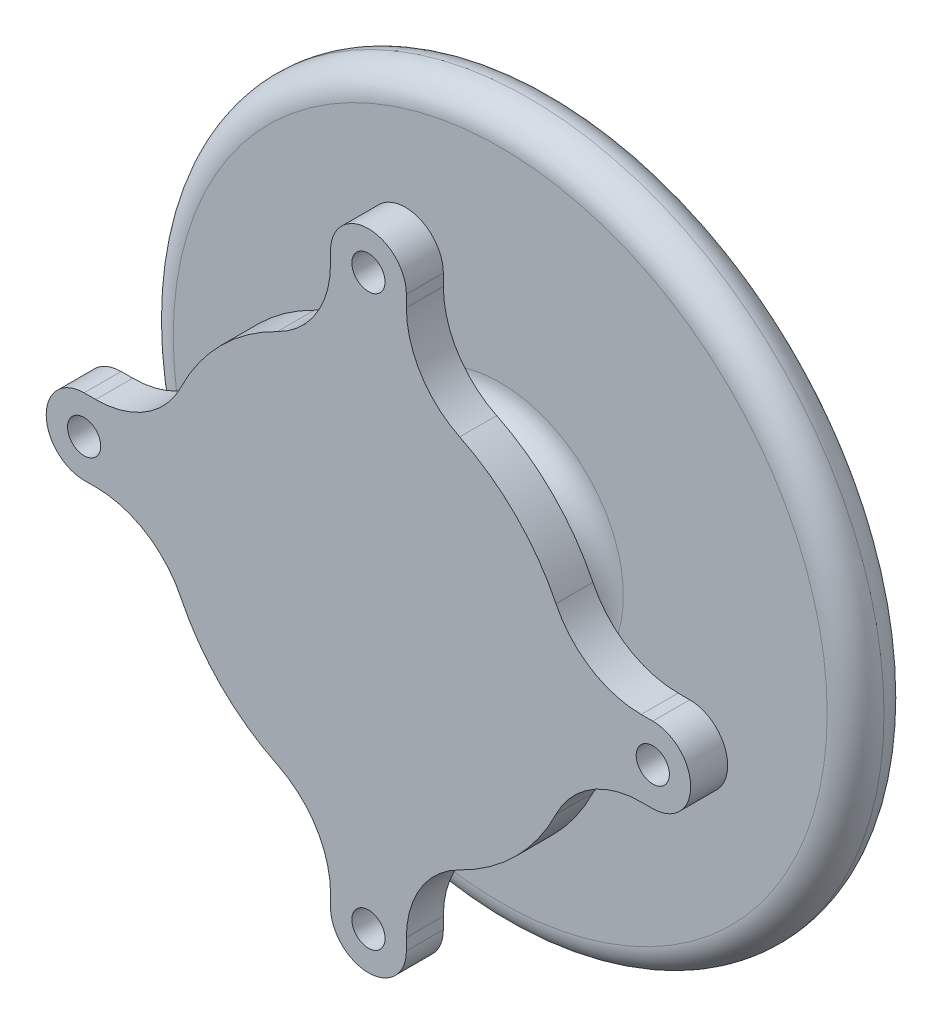
ISO-10303-21;
HEADER;
FILE_DESCRIPTION(('STEP AP214'),'2;1');
FILE_NAME('part.step','',(''),(''),'','','');
FILE_SCHEMA(('AUTOMOTIVE_DESIGN { 1 0 10303 214 1 1 1 1 }'));
ENDSEC;
DATA;
#1=APPLICATION_CONTEXT('core data for automotive mechanical design processes');
#2=APPLICATION_PROTOCOL_DEFINITION('international standard','automotive_design',2000,#1);
#3=PRODUCT_CONTEXT('',#1,'mechanical');
#4=PRODUCT('Part','Part','',(#3));
#5=PRODUCT_RELATED_PRODUCT_CATEGORY('part','',(#4));
#6=PRODUCT_DEFINITION_FORMATION('','',#4);
#7=PRODUCT_DEFINITION_CONTEXT('part definition',#1,'design');
#8=PRODUCT_DEFINITION('design','',#6,#7);
#9=PRODUCT_DEFINITION_SHAPE('','',#8);
#10=(LENGTH_UNIT() NAMED_UNIT(*) SI_UNIT(.MILLI.,.METRE.));
#11=(NAMED_UNIT(*) PLANE_ANGLE_UNIT() SI_UNIT($,.RADIAN.));
#12=(NAMED_UNIT(*) SI_UNIT($,.STERADIAN.) SOLID_ANGLE_UNIT());
#13=UNCERTAINTY_MEASURE_WITH_UNIT(LENGTH_MEASURE(1.E-05),#10,'distance_accuracy_value','');
#14=(GEOMETRIC_REPRESENTATION_CONTEXT(3) GLOBAL_UNCERTAINTY_ASSIGNED_CONTEXT((#13)) GLOBAL_UNIT_ASSIGNED_CONTEXT((#10,
#11,#12)) REPRESENTATION_CONTEXT('',''));
#15=CARTESIAN_POINT('',(0.,0.,0.));
#16=DIRECTION('',(0.,0.,1.));
#17=DIRECTION('',(1.,0.,0.));
#18=AXIS2_PLACEMENT_3D('',#15,#16,#17);
#19=CARTESIAN_POINT('',(0.,0.,28.9));
#20=DIRECTION('',(0.,0.,1.));
#21=DIRECTION('',(1.,0.,0.));
#22=AXIS2_PLACEMENT_3D('',#19,#20,#21);
#23=PLANE('',#22);
#24=DIRECTION('',(-1.,0.,0.));
#25=VECTOR('',#24,1.);
#26=CARTESIAN_POINT('',(-30.,-4.0000000000001,28.9));
#27=LINE('',#26,#25);
#28=CARTESIAN_POINT('',(-28.7749891398763,-4.0000000000001,28.9));
#29=VERTEX_POINT('',#28);
#30=CARTESIAN_POINT('',(-30.,-4.0000000000001,28.9));
#31=VERTEX_POINT('',#30);
#32=EDGE_CURVE('E485',#29,#31,#27,.T.);
#33=ORIENTED_EDGE('',*,*,#32,.F.);
#34=CARTESIAN_POINT('',(-28.7749891398763,-14.0000000000001,28.9));
#35=DIRECTION('',(0.,0.,1.));
#36=DIRECTION('',(1.,0.,0.));
#37=AXIS2_PLACEMENT_3D('',#34,#35,#36);
#38=CIRCLE('',#37,10.);
#39=CARTESIAN_POINT('',(-19.7828050336649,-9.62500000000007,28.9));
#40=VERTEX_POINT('',#39);
#41=EDGE_CURVE('E482',#29,#40,#38,.F.);
#42=ORIENTED_EDGE('',*,*,#41,.T.);
#43=CARTESIAN_POINT('',(0.,0.,28.9));
#44=DIRECTION('',(0.,0.,1.));
#45=DIRECTION('',(1.,0.,0.));
#46=AXIS2_PLACEMENT_3D('',#43,#44,#45);
#47=CIRCLE('',#46,22.);
#48=CARTESIAN_POINT('',(-9.625,-19.782805033665,28.9));
#49=VERTEX_POINT('',#48);
#50=EDGE_CURVE('E479',#40,#49,#47,.T.);
#51=ORIENTED_EDGE('',*,*,#50,.T.);
#52=CARTESIAN_POINT('',(-14.,-28.7749891398763,28.9));
#53=DIRECTION('',(0.,0.,1.));
#54=DIRECTION('',(1.,0.,0.));
#55=AXIS2_PLACEMENT_3D('',#52,#53,#54);
#56=CIRCLE('',#55,10.);
#57=CARTESIAN_POINT('',(-4.,-28.7749891398763,28.9));
#58=VERTEX_POINT('',#57);
#59=EDGE_CURVE('E472',#49,#58,#56,.F.);
#60=ORIENTED_EDGE('',*,*,#59,.T.);
#61=DIRECTION('',(0.,1.,0.));
#62=VECTOR('',#61,1.);
#63=CARTESIAN_POINT('',(-4.,-30.,28.9));
#64=LINE('',#63,#62);
#65=CARTESIAN_POINT('',(-4.,-30.,28.9));
#66=VERTEX_POINT('',#65);
#67=EDGE_CURVE('E462',#66,#58,#64,.T.);
#68=ORIENTED_EDGE('',*,*,#67,.F.);
#69=CARTESIAN_POINT('',(0.,-30.,28.9));
#70=DIRECTION('',(0.,0.,1.));
#71=DIRECTION('',(1.,0.,0.));
#72=AXIS2_PLACEMENT_3D('',#69,#70,#71);
#73=CIRCLE('',#72,4.);
#74=CARTESIAN_POINT('',(4.,-30.,28.9));
#75=VERTEX_POINT('',#74);
#76=EDGE_CURVE('E458',#75,#66,#73,.F.);
#77=ORIENTED_EDGE('',*,*,#76,.F.);
#78=DIRECTION('',(0.,-1.,0.));
#79=VECTOR('',#78,1.);
#80=CARTESIAN_POINT('',(4.,-30.,28.9));
#81=LINE('',#80,#79);
#82=CARTESIAN_POINT('',(4.,-28.7749891398763,28.9));
#83=VERTEX_POINT('',#82);
#84=EDGE_CURVE('E454',#83,#75,#81,.T.);
#85=ORIENTED_EDGE('',*,*,#84,.F.);
#86=CARTESIAN_POINT('',(14.,-28.7749891398763,28.9));
#87=DIRECTION('',(0.,0.,1.));
#88=DIRECTION('',(1.,0.,0.));
#89=AXIS2_PLACEMENT_3D('',#86,#87,#88);
#90=CIRCLE('',#89,10.);
#91=CARTESIAN_POINT('',(9.625,-19.782805033665,28.9));
#92=VERTEX_POINT('',#91);
#93=EDGE_CURVE('E451',#83,#92,#90,.F.);
#94=ORIENTED_EDGE('',*,*,#93,.T.);
#95=CARTESIAN_POINT('',(0.,0.,28.9));
#96=DIRECTION('',(0.,0.,1.));
#97=DIRECTION('',(1.,0.,0.));
#98=AXIS2_PLACEMENT_3D('',#95,#96,#97);
#99=CIRCLE('',#98,22.);
#100=CARTESIAN_POINT('',(19.7828050336651,-9.62499999999979,28.9));
#101=VERTEX_POINT('',#100);
#102=EDGE_CURVE('E445',#92,#101,#99,.T.);
#103=ORIENTED_EDGE('',*,*,#102,.T.);
#104=CARTESIAN_POINT('',(28.7749891398765,-13.9999999999997,28.9));
#105=DIRECTION('',(0.,0.,1.));
#106=DIRECTION('',(1.,0.,0.));
#107=AXIS2_PLACEMENT_3D('',#104,#105,#106);
#108=CIRCLE('',#107,10.);
#109=CARTESIAN_POINT('',(28.7749891398764,-3.9999999999997,28.9));
#110=VERTEX_POINT('',#109);
#111=EDGE_CURVE('E438',#101,#110,#108,.F.);
#112=ORIENTED_EDGE('',*,*,#111,.T.);
#113=DIRECTION('',(-1.,0.,0.));
#114=VECTOR('',#113,1.);
#115=CARTESIAN_POINT('',(30.,-3.99999999999969,28.9));
#116=LINE('',#115,#114);
#117=CARTESIAN_POINT('',(30.,-3.99999999999969,28.9));
#118=VERTEX_POINT('',#117);
#119=EDGE_CURVE('E431',#118,#110,#116,.T.);
#120=ORIENTED_EDGE('',*,*,#119,.F.);
#121=CARTESIAN_POINT('',(30.,3.14233320495882E-13,28.9));
#122=DIRECTION('',(0.,0.,1.));
#123=DIRECTION('',(1.,0.,0.));
#124=AXIS2_PLACEMENT_3D('',#121,#122,#123);
#125=CIRCLE('',#124,4.);
#126=CARTESIAN_POINT('',(30.,4.00000000000031,28.9));
#127=VERTEX_POINT('',#126);
#128=EDGE_CURVE('E427',#127,#118,#125,.F.);
#129=ORIENTED_EDGE('',*,*,#128,.F.);
#130=DIRECTION('',(1.,0.,0.));
#131=VECTOR('',#130,1.);
#132=CARTESIAN_POINT('',(30.,4.00000000000031,28.9));
#133=LINE('',#132,#131);
#134=CARTESIAN_POINT('',(28.7749891398763,4.0000000000003,28.9));
#135=VERTEX_POINT('',#134);
#136=EDGE_CURVE('E423',#135,#127,#133,.T.);
#137=ORIENTED_EDGE('',*,*,#136,.F.);
#138=CARTESIAN_POINT('',(28.7749891398762,14.0000000000003,28.9));
#139=DIRECTION('',(0.,0.,1.));
#140=DIRECTION('',(1.,0.,0.));
#141=AXIS2_PLACEMENT_3D('',#138,#139,#140);
#142=CIRCLE('',#141,10.);
#143=CARTESIAN_POINT('',(19.7828050336649,9.62500000000021,28.9));
#144=VERTEX_POINT('',#143);
#145=EDGE_CURVE('E420',#135,#144,#142,.F.);
#146=ORIENTED_EDGE('',*,*,#145,.T.);
#147=CARTESIAN_POINT('',(0.,0.,28.9));
#148=DIRECTION('',(0.,0.,1.));
#149=DIRECTION('',(1.,0.,0.));
#150=AXIS2_PLACEMENT_3D('',#147,#148,#149);
#151=CIRCLE('',#150,22.);
#152=CARTESIAN_POINT('',(9.625,19.782805033665,28.9));
#153=VERTEX_POINT('',#152);
#154=EDGE_CURVE('E62',#144,#153,#151,.T.);
#155=ORIENTED_EDGE('',*,*,#154,.T.);
#156=CARTESIAN_POINT('',(14.,28.7749891398763,28.9));
#157=DIRECTION('',(0.,0.,1.));
#158=DIRECTION('',(1.,0.,0.));
#159=AXIS2_PLACEMENT_3D('',#156,#157,#158);
#160=CIRCLE('',#159,10.);
#161=CARTESIAN_POINT('',(4.,28.7749891398763,28.9));
#162=VERTEX_POINT('',#161);
#163=EDGE_CURVE('E207',#153,#162,#160,.F.);
#164=ORIENTED_EDGE('',*,*,#163,.T.);
#165=DIRECTION('',(0.,-1.,0.));
#166=VECTOR('',#165,1.);
#167=CARTESIAN_POINT('',(4.,30.,28.9));
#168=LINE('',#167,#166);
#169=CARTESIAN_POINT('',(4.,30.,28.9));
#170=VERTEX_POINT('',#169);
#171=EDGE_CURVE('E209',#170,#162,#168,.T.);
#172=ORIENTED_EDGE('',*,*,#171,.F.);
#173=CARTESIAN_POINT('',(0.,30.,28.9));
#174=DIRECTION('',(0.,0.,1.));
#175=DIRECTION('',(1.,0.,0.));
#176=AXIS2_PLACEMENT_3D('',#173,#174,#175);
#177=CIRCLE('',#176,4.);
#178=CARTESIAN_POINT('',(-4.,30.,28.9));
#179=VERTEX_POINT('',#178);
#180=EDGE_CURVE('E435',#179,#170,#177,.F.);
#181=ORIENTED_EDGE('',*,*,#180,.F.);
#182=DIRECTION('',(0.,1.,0.));
#183=VECTOR('',#182,1.);
#184=CARTESIAN_POINT('',(-4.,30.,28.9));
#185=LINE('',#184,#183);
#186=CARTESIAN_POINT('',(-4.,28.7749891398763,28.9));
#187=VERTEX_POINT('',#186);
#188=EDGE_CURVE('E441',#187,#179,#185,.T.);
#189=ORIENTED_EDGE('',*,*,#188,.F.);
#190=CARTESIAN_POINT('',(-14.,28.7749891398763,28.9));
#191=DIRECTION('',(0.,0.,1.));
#192=DIRECTION('',(1.,0.,0.));
#193=AXIS2_PLACEMENT_3D('',#190,#191,#192);
#194=CIRCLE('',#193,10.);
#195=CARTESIAN_POINT('',(-9.625,19.782805033665,28.9));
#196=VERTEX_POINT('',#195);
#197=EDGE_CURVE('E448',#187,#196,#194,.F.);
#198=ORIENTED_EDGE('',*,*,#197,.T.);
#199=CARTESIAN_POINT('',(0.,0.,28.9));
#200=DIRECTION('',(0.,0.,1.));
#201=DIRECTION('',(1.,0.,0.));
#202=AXIS2_PLACEMENT_3D('',#199,#200,#201);
#203=CIRCLE('',#202,22.);
#204=CARTESIAN_POINT('',(-19.782805033665,9.62499999999993,28.9));
#205=VERTEX_POINT('',#204);
#206=EDGE_CURVE('E466',#196,#205,#203,.T.);
#207=ORIENTED_EDGE('',*,*,#206,.T.);
#208=CARTESIAN_POINT('',(-28.7749891398764,13.9999999999999,28.9));
#209=DIRECTION('',(0.,0.,1.));
#210=DIRECTION('',(1.,0.,0.));
#211=AXIS2_PLACEMENT_3D('',#208,#209,#210);
#212=CIRCLE('',#211,10.);
#213=CARTESIAN_POINT('',(-28.7749891398763,3.9999999999999,28.9));
#214=VERTEX_POINT('',#213);
#215=EDGE_CURVE('E469',#205,#214,#212,.F.);
#216=ORIENTED_EDGE('',*,*,#215,.T.);
#217=DIRECTION('',(1.,0.,0.));
#218=VECTOR('',#217,1.);
#219=CARTESIAN_POINT('',(-30.,3.9999999999999,28.9));
#220=LINE('',#219,#218);
#221=CARTESIAN_POINT('',(-30.,3.9999999999999,28.9));
#222=VERTEX_POINT('',#221);
#223=EDGE_CURVE('E475',#222,#214,#220,.T.);
#224=ORIENTED_EDGE('',*,*,#223,.F.);
#225=CARTESIAN_POINT('',(-30.,-1.04744440165294E-13,28.9));
#226=DIRECTION('',(0.,0.,1.));
#227=DIRECTION('',(1.,0.,0.));
#228=AXIS2_PLACEMENT_3D('',#225,#226,#227);
#229=CIRCLE('',#228,4.);
#230=EDGE_CURVE('E489',#31,#222,#229,.F.);
#231=ORIENTED_EDGE('',*,*,#230,.F.);
#232=EDGE_LOOP('',(#33,#42,#51,#60,#68,#77,#85,#94,#103,#112,#120,#129,#137,#146,#155,#164,#172,
#181,#189,#198,#207,#216,#224,#231));
#233=FACE_BOUND('',#232,.T.);
#234=CARTESIAN_POINT('',(30.,3.14233320495882E-13,28.9));
#235=DIRECTION('',(0.,0.,1.));
#236=DIRECTION('',(1.,0.,0.));
#237=AXIS2_PLACEMENT_3D('',#234,#235,#236);
#238=CIRCLE('',#237,1.75);
#239=CARTESIAN_POINT('',(31.75,3.14233320495882E-13,28.9));
#240=VERTEX_POINT('',#239);
#241=EDGE_CURVE('E493',#240,#240,#238,.F.);
#242=ORIENTED_EDGE('',*,*,#241,.T.);
#243=EDGE_LOOP('',(#242));
#244=FACE_BOUND('',#243,.T.);
#245=CARTESIAN_POINT('',(0.,-30.,28.9));
#246=DIRECTION('',(0.,0.,1.));
#247=DIRECTION('',(1.,0.,0.));
#248=AXIS2_PLACEMENT_3D('',#245,#246,#247);
#249=CIRCLE('',#248,1.75);
#250=CARTESIAN_POINT('',(1.75,-30.,28.9));
#251=VERTEX_POINT('',#250);
#252=EDGE_CURVE('E497',#251,#251,#249,.F.);
#253=ORIENTED_EDGE('',*,*,#252,.T.);
#254=EDGE_LOOP('',(#253));
#255=FACE_BOUND('',#254,.T.);
#256=CARTESIAN_POINT('',(-30.,-1.04744440165294E-13,28.9));
#257=DIRECTION('',(0.,0.,1.));
#258=DIRECTION('',(1.,0.,0.));
#259=AXIS2_PLACEMENT_3D('',#256,#257,#258);
#260=CIRCLE('',#259,1.75);
#261=CARTESIAN_POINT('',(-28.25,-1.04744440165294E-13,28.9));
#262=VERTEX_POINT('',#261);
#263=EDGE_CURVE('E501',#262,#262,#260,.F.);
#264=ORIENTED_EDGE('',*,*,#263,.T.);
#265=EDGE_LOOP('',(#264));
#266=FACE_BOUND('',#265,.T.);
#267=CARTESIAN_POINT('',(0.,30.,28.9));
#268=DIRECTION('',(0.,0.,1.));
#269=DIRECTION('',(1.,0.,0.));
#270=AXIS2_PLACEMENT_3D('',#267,#268,#269);
#271=CIRCLE('',#270,1.75);
#272=CARTESIAN_POINT('',(1.75,30.,28.9));
#273=VERTEX_POINT('',#272);
#274=EDGE_CURVE('E505',#273,#273,#271,.F.);
#275=ORIENTED_EDGE('',*,*,#274,.T.);
#276=EDGE_LOOP('',(#275));
#277=FACE_BOUND('',#276,.T.);
#278=ADVANCED_FACE('F45',(#233,#244,#255,#266,#277),#23,.T.);
#279=CARTESIAN_POINT('',(30.,3.14233320495882E-13,29.));
#280=DIRECTION('',(0.,0.,-1.));
#281=DIRECTION('',(-1.,0.,0.));
#282=AXIS2_PLACEMENT_3D('',#279,#280,#281);
#283=CYLINDRICAL_SURFACE('',#282,1.75);
#284=CARTESIAN_POINT('',(30.,3.14233320495882E-13,25.));
#285=DIRECTION('',(0.,0.,-1.));
#286=DIRECTION('',(0.,1.,0.));
#287=AXIS2_PLACEMENT_3D('',#284,#285,#286);
#288=CIRCLE('',#287,1.75);
#289=CARTESIAN_POINT('',(30.,1.75000000000032,25.));
#290=VERTEX_POINT('',#289);
#291=EDGE_CURVE('E509',#290,#290,#288,.T.);
#292=ORIENTED_EDGE('',*,*,#291,.T.);
#293=EDGE_LOOP('',(#292));
#294=FACE_BOUND('',#293,.T.);
#295=ORIENTED_EDGE('',*,*,#241,.F.);
#296=EDGE_LOOP('',(#295));
#297=FACE_BOUND('',#296,.T.);
#298=ADVANCED_FACE('F306',(#294,#297),#283,.F.);
#299=CARTESIAN_POINT('',(0.,-30.,29.));
#300=DIRECTION('',(0.,0.,-1.));
#301=DIRECTION('',(-1.,0.,0.));
#302=AXIS2_PLACEMENT_3D('',#299,#300,#301);
#303=CYLINDRICAL_SURFACE('',#302,1.75);
#304=CARTESIAN_POINT('',(0.,-30.,25.));
#305=DIRECTION('',(0.,0.,-1.));
#306=DIRECTION('',(1.,0.,0.));
#307=AXIS2_PLACEMENT_3D('',#304,#305,#306);
#308=CIRCLE('',#307,1.75);
#309=CARTESIAN_POINT('',(1.75,-30.,25.));
#310=VERTEX_POINT('',#309);
#311=EDGE_CURVE('E531',#310,#310,#308,.T.);
#312=ORIENTED_EDGE('',*,*,#311,.T.);
#313=EDGE_LOOP('',(#312));
#314=FACE_BOUND('',#313,.T.);
#315=ORIENTED_EDGE('',*,*,#252,.F.);
#316=EDGE_LOOP('',(#315));
#317=FACE_BOUND('',#316,.T.);
#318=ADVANCED_FACE('F310',(#314,#317),#303,.F.);
#319=CARTESIAN_POINT('',(-30.,-1.04744440165294E-13,29.));
#320=DIRECTION('',(0.,0.,-1.));
#321=DIRECTION('',(-1.,0.,0.));
#322=AXIS2_PLACEMENT_3D('',#319,#320,#321);
#323=CYLINDRICAL_SURFACE('',#322,1.75);
#324=CARTESIAN_POINT('',(-30.,-1.04744440165294E-13,25.));
#325=DIRECTION('',(0.,0.,-1.));
#326=DIRECTION('',(0.,-1.,0.));
#327=AXIS2_PLACEMENT_3D('',#324,#325,#326);
#328=CIRCLE('',#327,1.75);
#329=CARTESIAN_POINT('',(-30.,-1.75000000000011,25.));
#330=VERTEX_POINT('',#329);
#331=EDGE_CURVE('E553',#330,#330,#328,.T.);
#332=ORIENTED_EDGE('',*,*,#331,.T.);
#333=EDGE_LOOP('',(#332));
#334=FACE_BOUND('',#333,.T.);
#335=ORIENTED_EDGE('',*,*,#263,.F.);
#336=EDGE_LOOP('',(#335));
#337=FACE_BOUND('',#336,.T.);
#338=ADVANCED_FACE('F329',(#334,#337),#323,.F.);
#339=CARTESIAN_POINT('',(0.,30.,29.));
#340=DIRECTION('',(0.,0.,-1.));
#341=DIRECTION('',(-1.,0.,0.));
#342=AXIS2_PLACEMENT_3D('',#339,#340,#341);
#343=CYLINDRICAL_SURFACE('',#342,1.75);
#344=CARTESIAN_POINT('',(0.,30.,25.));
#345=DIRECTION('',(0.,0.,-1.));
#346=DIRECTION('',(-1.,0.,0.));
#347=AXIS2_PLACEMENT_3D('',#344,#345,#346);
#348=CIRCLE('',#347,1.75);
#349=CARTESIAN_POINT('',(-1.75,30.,25.));
#350=VERTEX_POINT('',#349);
#351=EDGE_CURVE('E575',#350,#350,#348,.T.);
#352=ORIENTED_EDGE('',*,*,#351,.T.);
#353=EDGE_LOOP('',(#352));
#354=FACE_BOUND('',#353,.T.);
#355=ORIENTED_EDGE('',*,*,#274,.F.);
#356=EDGE_LOOP('',(#355));
#357=FACE_BOUND('',#356,.T.);
#358=ADVANCED_FACE('F347',(#354,#357),#343,.F.);
#359=CARTESIAN_POINT('',(0.,0.,25.));
#360=DIRECTION('',(0.,0.,1.));
#361=DIRECTION('',(1.,0.,0.));
#362=AXIS2_PLACEMENT_3D('',#359,#360,#361);
#363=PLANE('',#362);
#364=CARTESIAN_POINT('',(0.,0.,25.));
#365=DIRECTION('',(0.,0.,1.));
#366=DIRECTION('',(1.,0.,0.));
#367=AXIS2_PLACEMENT_3D('',#364,#365,#366);
#368=CIRCLE('',#367,13.);
#369=CARTESIAN_POINT('',(13.,0.,25.));
#370=VERTEX_POINT('',#369);
#371=EDGE_CURVE('E55',#370,#370,#368,.T.);
#372=ORIENTED_EDGE('',*,*,#371,.T.);
#373=EDGE_LOOP('',(#372));
#374=FACE_BOUND('',#373,.T.);
#375=CARTESIAN_POINT('',(0.,0.,25.));
#376=DIRECTION('',(0.,0.,1.));
#377=DIRECTION('',(1.,0.,0.));
#378=AXIS2_PLACEMENT_3D('',#375,#376,#377);
#379=CIRCLE('',#378,22.);
#380=CARTESIAN_POINT('',(-9.625,19.782805033665,25.));
#381=VERTEX_POINT('',#380);
#382=CARTESIAN_POINT('',(-19.782805033665,9.62499999999993,25.));
#383=VERTEX_POINT('',#382);
#384=EDGE_CURVE('E601',#381,#383,#379,.T.);
#385=ORIENTED_EDGE('',*,*,#384,.F.);
#386=CARTESIAN_POINT('',(-14.,28.7749891398763,25.));
#387=DIRECTION('',(0.,0.,1.));
#388=DIRECTION('',(1.,0.,0.));
#389=AXIS2_PLACEMENT_3D('',#386,#387,#388);
#390=CIRCLE('',#389,10.);
#391=CARTESIAN_POINT('',(-4.,28.7749891398763,25.));
#392=VERTEX_POINT('',#391);
#393=EDGE_CURVE('E252',#381,#392,#390,.T.);
#394=ORIENTED_EDGE('',*,*,#393,.T.);
#395=DIRECTION('',(0.,1.,0.));
#396=VECTOR('',#395,1.);
#397=CARTESIAN_POINT('',(-4.,30.,25.));
#398=LINE('',#397,#396);
#399=CARTESIAN_POINT('',(-4.,30.,25.));
#400=VERTEX_POINT('',#399);
#401=EDGE_CURVE('E579',#392,#400,#398,.T.);
#402=ORIENTED_EDGE('',*,*,#401,.T.);
#403=CARTESIAN_POINT('',(0.,30.,25.));
#404=DIRECTION('',(0.,0.,-1.));
#405=DIRECTION('',(-1.,0.,0.));
#406=AXIS2_PLACEMENT_3D('',#403,#404,#405);
#407=CIRCLE('',#406,4.);
#408=CARTESIAN_POINT('',(4.,30.,25.));
#409=VERTEX_POINT('',#408);
#410=EDGE_CURVE('E583',#400,#409,#407,.T.);
#411=ORIENTED_EDGE('',*,*,#410,.T.);
#412=DIRECTION('',(0.,-1.,0.));
#413=VECTOR('',#412,1.);
#414=CARTESIAN_POINT('',(4.,30.,25.));
#415=LINE('',#414,#413);
#416=CARTESIAN_POINT('',(4.,28.7749891398763,25.));
#417=VERTEX_POINT('',#416);
#418=EDGE_CURVE('E587',#409,#417,#415,.T.);
#419=ORIENTED_EDGE('',*,*,#418,.T.);
#420=CARTESIAN_POINT('',(14.,28.7749891398763,25.));
#421=DIRECTION('',(0.,0.,1.));
#422=DIRECTION('',(1.,0.,0.));
#423=AXIS2_PLACEMENT_3D('',#420,#421,#422);
#424=CIRCLE('',#423,10.);
#425=CARTESIAN_POINT('',(9.625,19.782805033665,25.));
#426=VERTEX_POINT('',#425);
#427=EDGE_CURVE('E216',#417,#426,#424,.T.);
#428=ORIENTED_EDGE('',*,*,#427,.T.);
#429=CARTESIAN_POINT('',(19.7828050336649,9.62500000000021,25.));
#430=VERTEX_POINT('',#429);
#431=EDGE_CURVE('E595',#430,#426,#379,.T.);
#432=ORIENTED_EDGE('',*,*,#431,.F.);
#433=CARTESIAN_POINT('',(28.7749891398762,14.0000000000003,25.));
#434=DIRECTION('',(0.,0.,1.));
#435=DIRECTION('',(1.,0.,0.));
#436=AXIS2_PLACEMENT_3D('',#433,#434,#435);
#437=CIRCLE('',#436,10.);
#438=CARTESIAN_POINT('',(28.7749891398763,4.0000000000003,25.));
#439=VERTEX_POINT('',#438);
#440=EDGE_CURVE('E226',#430,#439,#437,.T.);
#441=ORIENTED_EDGE('',*,*,#440,.T.);
#442=DIRECTION('',(1.,0.,0.));
#443=VECTOR('',#442,1.);
#444=CARTESIAN_POINT('',(30.,4.00000000000031,25.));
#445=LINE('',#444,#443);
#446=CARTESIAN_POINT('',(30.,4.00000000000031,25.));
#447=VERTEX_POINT('',#446);
#448=EDGE_CURVE('E513',#439,#447,#445,.T.);
#449=ORIENTED_EDGE('',*,*,#448,.T.);
#450=CARTESIAN_POINT('',(30.,3.14233320495882E-13,25.));
#451=DIRECTION('',(0.,0.,-1.));
#452=DIRECTION('',(0.,1.,0.));
#453=AXIS2_PLACEMENT_3D('',#450,#451,#452);
#454=CIRCLE('',#453,4.);
#455=CARTESIAN_POINT('',(30.,-3.99999999999969,25.));
#456=VERTEX_POINT('',#455);
#457=EDGE_CURVE('E517',#447,#456,#454,.T.);
#458=ORIENTED_EDGE('',*,*,#457,.T.);
#459=DIRECTION('',(-1.,0.,0.));
#460=VECTOR('',#459,1.);
#461=CARTESIAN_POINT('',(30.,-3.99999999999969,25.));
#462=LINE('',#461,#460);
#463=CARTESIAN_POINT('',(28.7749891398764,-3.9999999999997,25.));
#464=VERTEX_POINT('',#463);
#465=EDGE_CURVE('E521',#456,#464,#462,.T.);
#466=ORIENTED_EDGE('',*,*,#465,.T.);
#467=CARTESIAN_POINT('',(28.7749891398765,-13.9999999999997,25.));
#468=DIRECTION('',(0.,0.,1.));
#469=DIRECTION('',(1.,0.,0.));
#470=AXIS2_PLACEMENT_3D('',#467,#468,#469);
#471=CIRCLE('',#470,10.);
#472=CARTESIAN_POINT('',(19.7828050336651,-9.62499999999979,25.));
#473=VERTEX_POINT('',#472);
#474=EDGE_CURVE('E231',#464,#473,#471,.T.);
#475=ORIENTED_EDGE('',*,*,#474,.T.);
#476=CARTESIAN_POINT('',(9.625,-19.782805033665,25.));
#477=VERTEX_POINT('',#476);
#478=EDGE_CURVE('E599',#477,#473,#379,.T.);
#479=ORIENTED_EDGE('',*,*,#478,.F.);
#480=CARTESIAN_POINT('',(14.,-28.7749891398763,25.));
#481=DIRECTION('',(0.,0.,1.));
#482=DIRECTION('',(1.,0.,0.));
#483=AXIS2_PLACEMENT_3D('',#480,#481,#482);
#484=CIRCLE('',#483,10.);
#485=CARTESIAN_POINT('',(4.,-28.7749891398763,25.));
#486=VERTEX_POINT('',#485);
#487=EDGE_CURVE('E240',#477,#486,#484,.T.);
#488=ORIENTED_EDGE('',*,*,#487,.T.);
#489=DIRECTION('',(0.,-1.,0.));
#490=VECTOR('',#489,1.);
#491=CARTESIAN_POINT('',(4.,-30.,25.));
#492=LINE('',#491,#490);
#493=CARTESIAN_POINT('',(4.,-30.,25.));
#494=VERTEX_POINT('',#493);
#495=EDGE_CURVE('E535',#486,#494,#492,.T.);
#496=ORIENTED_EDGE('',*,*,#495,.T.);
#497=CARTESIAN_POINT('',(0.,-30.,25.));
#498=DIRECTION('',(0.,0.,-1.));
#499=DIRECTION('',(1.,0.,0.));
#500=AXIS2_PLACEMENT_3D('',#497,#498,#499);
#501=CIRCLE('',#500,4.);
#502=CARTESIAN_POINT('',(-4.,-30.,25.));
#503=VERTEX_POINT('',#502);
#504=EDGE_CURVE('E539',#494,#503,#501,.T.);
#505=ORIENTED_EDGE('',*,*,#504,.T.);
#506=DIRECTION('',(0.,1.,0.));
#507=VECTOR('',#506,1.);
#508=CARTESIAN_POINT('',(-4.,-30.,25.));
#509=LINE('',#508,#507);
#510=CARTESIAN_POINT('',(-4.,-28.7749891398763,25.));
#511=VERTEX_POINT('',#510);
#512=EDGE_CURVE('E543',#503,#511,#509,.T.);
#513=ORIENTED_EDGE('',*,*,#512,.T.);
#514=CARTESIAN_POINT('',(-14.,-28.7749891398763,25.));
#515=DIRECTION('',(0.,0.,1.));
#516=DIRECTION('',(1.,0.,0.));
#517=AXIS2_PLACEMENT_3D('',#514,#515,#516);
#518=CIRCLE('',#517,10.);
#519=CARTESIAN_POINT('',(-9.625,-19.782805033665,25.));
#520=VERTEX_POINT('',#519);
#521=EDGE_CURVE('E243',#511,#520,#518,.T.);
#522=ORIENTED_EDGE('',*,*,#521,.T.);
#523=CARTESIAN_POINT('',(-19.7828050336649,-9.62500000000007,25.));
#524=VERTEX_POINT('',#523);
#525=EDGE_CURVE('E604',#524,#520,#379,.T.);
#526=ORIENTED_EDGE('',*,*,#525,.F.);
#527=CARTESIAN_POINT('',(-28.7749891398763,-14.0000000000001,25.));
#528=DIRECTION('',(0.,0.,1.));
#529=DIRECTION('',(1.,0.,0.));
#530=AXIS2_PLACEMENT_3D('',#527,#528,#529);
#531=CIRCLE('',#530,10.);
#532=CARTESIAN_POINT('',(-28.7749891398763,-4.0000000000001,25.));
#533=VERTEX_POINT('',#532);
#534=EDGE_CURVE('E246',#524,#533,#531,.T.);
#535=ORIENTED_EDGE('',*,*,#534,.T.);
#536=DIRECTION('',(-1.,0.,0.));
#537=VECTOR('',#536,1.);
#538=CARTESIAN_POINT('',(-30.,-4.0000000000001,25.));
#539=LINE('',#538,#537);
#540=CARTESIAN_POINT('',(-30.,-4.0000000000001,25.));
#541=VERTEX_POINT('',#540);
#542=EDGE_CURVE('E557',#533,#541,#539,.T.);
#543=ORIENTED_EDGE('',*,*,#542,.T.);
#544=CARTESIAN_POINT('',(-30.,-1.04744440165294E-13,25.));
#545=DIRECTION('',(0.,0.,-1.));
#546=DIRECTION('',(0.,-1.,0.));
#547=AXIS2_PLACEMENT_3D('',#544,#545,#546);
#548=CIRCLE('',#547,4.);
#549=CARTESIAN_POINT('',(-30.,3.9999999999999,25.));
#550=VERTEX_POINT('',#549);
#551=EDGE_CURVE('E561',#541,#550,#548,.T.);
#552=ORIENTED_EDGE('',*,*,#551,.T.);
#553=DIRECTION('',(1.,0.,0.));
#554=VECTOR('',#553,1.);
#555=CARTESIAN_POINT('',(-30.,3.9999999999999,25.));
#556=LINE('',#555,#554);
#557=CARTESIAN_POINT('',(-28.7749891398763,3.9999999999999,25.));
#558=VERTEX_POINT('',#557);
#559=EDGE_CURVE('E565',#550,#558,#556,.T.);
#560=ORIENTED_EDGE('',*,*,#559,.T.);
#561=CARTESIAN_POINT('',(-28.7749891398764,13.9999999999999,25.));
#562=DIRECTION('',(0.,0.,1.));
#563=DIRECTION('',(1.,0.,0.));
#564=AXIS2_PLACEMENT_3D('',#561,#562,#563);
#565=CIRCLE('',#564,10.);
#566=EDGE_CURVE('E249',#558,#383,#565,.T.);
#567=ORIENTED_EDGE('',*,*,#566,.T.);
#568=EDGE_LOOP('',(#385,#394,#402,#411,#419,#428,#432,#441,#449,#458,#466,#475,#479,#488,#496,
#505,#513,#522,#526,#535,#543,#552,#560,#567));
#569=FACE_BOUND('',#568,.T.);
#570=ORIENTED_EDGE('',*,*,#351,.F.);
#571=EDGE_LOOP('',(#570));
#572=FACE_BOUND('',#571,.T.);
#573=ORIENTED_EDGE('',*,*,#331,.F.);
#574=EDGE_LOOP('',(#573));
#575=FACE_BOUND('',#574,.T.);
#576=ORIENTED_EDGE('',*,*,#311,.F.);
#577=EDGE_LOOP('',(#576));
#578=FACE_BOUND('',#577,.T.);
#579=ORIENTED_EDGE('',*,*,#291,.F.);
#580=EDGE_LOOP('',(#579));
#581=FACE_BOUND('',#580,.T.);
#582=ADVANCED_FACE('F276',(#374,#569,#572,#575,#578,#581),#363,.F.);
#583=CARTESIAN_POINT('',(-14.,-28.7749891398763,29.));
#584=DIRECTION('',(0.,0.,-1.));
#585=DIRECTION('',(-1.,0.,0.));
#586=AXIS2_PLACEMENT_3D('',#583,#584,#585);
#587=CYLINDRICAL_SURFACE('',#586,10.);
#588=ORIENTED_EDGE('',*,*,#59,.F.);
#589=DIRECTION('',(0.,0.,-1.));
#590=VECTOR('',#589,1.);
#591=CARTESIAN_POINT('',(-9.625,-19.782805033665,29.));
#592=LINE('',#591,#590);
#593=EDGE_CURVE('E638',#520,#49,#592,.F.);
#594=ORIENTED_EDGE('',*,*,#593,.F.);
#595=ORIENTED_EDGE('',*,*,#521,.F.);
#596=DIRECTION('',(0.,0.,-1.));
#597=VECTOR('',#596,1.);
#598=CARTESIAN_POINT('',(-4.,-28.7749891398763,29.));
#599=LINE('',#598,#597);
#600=EDGE_CURVE('E632',#58,#511,#599,.T.);
#601=ORIENTED_EDGE('',*,*,#600,.F.);
#602=EDGE_LOOP('',(#588,#594,#595,#601));
#603=FACE_BOUND('',#602,.T.);
#604=ADVANCED_FACE('F378',(#603),#587,.F.);
#605=CARTESIAN_POINT('',(14.,-28.7749891398763,29.));
#606=DIRECTION('',(0.,0.,-1.));
#607=DIRECTION('',(-1.,0.,0.));
#608=AXIS2_PLACEMENT_3D('',#605,#606,#607);
#609=CYLINDRICAL_SURFACE('',#608,10.);
#610=ORIENTED_EDGE('',*,*,#93,.F.);
#611=DIRECTION('',(0.,0.,-1.));
#612=VECTOR('',#611,1.);
#613=CARTESIAN_POINT('',(4.,-28.7749891398763,29.));
#614=LINE('',#613,#612);
#615=EDGE_CURVE('E628',#486,#83,#614,.F.);
#616=ORIENTED_EDGE('',*,*,#615,.F.);
#617=ORIENTED_EDGE('',*,*,#487,.F.);
#618=DIRECTION('',(0.,0.,-1.));
#619=VECTOR('',#618,1.);
#620=CARTESIAN_POINT('',(9.625,-19.782805033665,29.));
#621=LINE('',#620,#619);
#622=EDGE_CURVE('E621',#92,#477,#621,.T.);
#623=ORIENTED_EDGE('',*,*,#622,.F.);
#624=EDGE_LOOP('',(#610,#616,#617,#623));
#625=FACE_BOUND('',#624,.T.);
#626=ADVANCED_FACE('F343',(#625),#609,.F.);
#627=CARTESIAN_POINT('',(4.,-30.,29.));
#628=DIRECTION('',(1.,0.,0.));
#629=DIRECTION('',(0.,0.,-1.));
#630=AXIS2_PLACEMENT_3D('',#627,#628,#629);
#631=PLANE('',#630);
#632=ORIENTED_EDGE('',*,*,#615,.T.);
#633=ORIENTED_EDGE('',*,*,#84,.T.);
#634=DIRECTION('',(0.,0.,-1.));
#635=VECTOR('',#634,1.);
#636=CARTESIAN_POINT('',(4.,-30.,29.));
#637=LINE('',#636,#635);
#638=EDGE_CURVE('E547',#75,#494,#637,.T.);
#639=ORIENTED_EDGE('',*,*,#638,.T.);
#640=ORIENTED_EDGE('',*,*,#495,.F.);
#641=EDGE_LOOP('',(#632,#633,#639,#640));
#642=FACE_BOUND('',#641,.T.);
#643=ADVANCED_FACE('F339',(#642),#631,.T.);
#644=CARTESIAN_POINT('',(0.,-30.,29.));
#645=DIRECTION('',(0.,0.,-1.));
#646=DIRECTION('',(-1.,0.,0.));
#647=AXIS2_PLACEMENT_3D('',#644,#645,#646);
#648=CYLINDRICAL_SURFACE('',#647,4.);
#649=ORIENTED_EDGE('',*,*,#638,.F.);
#650=ORIENTED_EDGE('',*,*,#76,.T.);
#651=DIRECTION('',(0.,0.,-1.));
#652=VECTOR('',#651,1.);
#653=CARTESIAN_POINT('',(-4.,-30.,29.));
#654=LINE('',#653,#652);
#655=EDGE_CURVE('E550',#66,#503,#654,.T.);
#656=ORIENTED_EDGE('',*,*,#655,.T.);
#657=ORIENTED_EDGE('',*,*,#504,.F.);
#658=EDGE_LOOP('',(#649,#650,#656,#657));
#659=FACE_BOUND('',#658,.T.);
#660=ADVANCED_FACE('F335',(#659),#648,.T.);
#661=CARTESIAN_POINT('',(-4.,-30.,29.));
#662=DIRECTION('',(-1.,0.,0.));
#663=DIRECTION('',(0.,0.,1.));
#664=AXIS2_PLACEMENT_3D('',#661,#662,#663);
#665=PLANE('',#664);
#666=ORIENTED_EDGE('',*,*,#655,.F.);
#667=ORIENTED_EDGE('',*,*,#67,.T.);
#668=ORIENTED_EDGE('',*,*,#600,.T.);
#669=ORIENTED_EDGE('',*,*,#512,.F.);
#670=EDGE_LOOP('',(#666,#667,#668,#669));
#671=FACE_BOUND('',#670,.T.);
#672=ADVANCED_FACE('F331',(#671),#665,.T.);
#673=CARTESIAN_POINT('',(-28.7749891398764,13.9999999999999,29.));
#674=DIRECTION('',(0.,0.,-1.));
#675=DIRECTION('',(-1.,0.,0.));
#676=AXIS2_PLACEMENT_3D('',#673,#674,#675);
#677=CYLINDRICAL_SURFACE('',#676,10.);
#678=ORIENTED_EDGE('',*,*,#215,.F.);
#679=DIRECTION('',(0.,0.,-1.));
#680=VECTOR('',#679,1.);
#681=CARTESIAN_POINT('',(-19.782805033665,9.62499999999993,29.));
#682=LINE('',#681,#680);
#683=EDGE_CURVE('E234',#383,#205,#682,.F.);
#684=ORIENTED_EDGE('',*,*,#683,.F.);
#685=ORIENTED_EDGE('',*,*,#566,.F.);
#686=DIRECTION('',(0.,0.,-1.));
#687=VECTOR('',#686,1.);
#688=CARTESIAN_POINT('',(-28.7749891398763,3.9999999999999,29.));
#689=LINE('',#688,#687);
#690=EDGE_CURVE('E646',#214,#558,#689,.T.);
#691=ORIENTED_EDGE('',*,*,#690,.F.);
#692=EDGE_LOOP('',(#678,#684,#685,#691));
#693=FACE_BOUND('',#692,.T.);
#694=ADVANCED_FACE('F334',(#693),#677,.F.);
#695=CARTESIAN_POINT('',(-28.7749891398763,-14.0000000000001,29.));
#696=DIRECTION('',(0.,0.,-1.));
#697=DIRECTION('',(-1.,0.,0.));
#698=AXIS2_PLACEMENT_3D('',#695,#696,#697);
#699=CYLINDRICAL_SURFACE('',#698,10.);
#700=ORIENTED_EDGE('',*,*,#41,.F.);
#701=DIRECTION('',(0.,0.,-1.));
#702=VECTOR('',#701,1.);
#703=CARTESIAN_POINT('',(-28.7749891398763,-4.0000000000001,29.));
#704=LINE('',#703,#702);
#705=EDGE_CURVE('E642',#533,#29,#704,.F.);
#706=ORIENTED_EDGE('',*,*,#705,.F.);
#707=ORIENTED_EDGE('',*,*,#534,.F.);
#708=DIRECTION('',(0.,0.,-1.));
#709=VECTOR('',#708,1.);
#710=CARTESIAN_POINT('',(-19.7828050336649,-9.62500000000007,29.));
#711=LINE('',#710,#709);
#712=EDGE_CURVE('E635',#40,#524,#711,.T.);
#713=ORIENTED_EDGE('',*,*,#712,.F.);
#714=EDGE_LOOP('',(#700,#706,#707,#713));
#715=FACE_BOUND('',#714,.T.);
#716=ADVANCED_FACE('F360',(#715),#699,.F.);
#717=CARTESIAN_POINT('',(-30.,-4.0000000000001,29.));
#718=DIRECTION('',(0.,-1.,0.));
#719=DIRECTION('',(1.,0.,0.));
#720=AXIS2_PLACEMENT_3D('',#717,#718,#719);
#721=PLANE('',#720);
#722=ORIENTED_EDGE('',*,*,#705,.T.);
#723=ORIENTED_EDGE('',*,*,#32,.T.);
#724=DIRECTION('',(0.,0.,-1.));
#725=VECTOR('',#724,1.);
#726=CARTESIAN_POINT('',(-30.,-4.0000000000001,29.));
#727=LINE('',#726,#725);
#728=EDGE_CURVE('E569',#31,#541,#727,.T.);
#729=ORIENTED_EDGE('',*,*,#728,.T.);
#730=ORIENTED_EDGE('',*,*,#542,.F.);
#731=EDGE_LOOP('',(#722,#723,#729,#730));
#732=FACE_BOUND('',#731,.T.);
#733=ADVANCED_FACE('F356',(#732),#721,.T.);
#734=CARTESIAN_POINT('',(-30.,-1.04744440165294E-13,29.));
#735=DIRECTION('',(0.,0.,-1.));
#736=DIRECTION('',(-1.,0.,0.));
#737=AXIS2_PLACEMENT_3D('',#734,#735,#736);
#738=CYLINDRICAL_SURFACE('',#737,4.);
#739=ORIENTED_EDGE('',*,*,#728,.F.);
#740=ORIENTED_EDGE('',*,*,#230,.T.);
#741=DIRECTION('',(0.,0.,-1.));
#742=VECTOR('',#741,1.);
#743=CARTESIAN_POINT('',(-30.,3.9999999999999,29.));
#744=LINE('',#743,#742);
#745=EDGE_CURVE('E572',#222,#550,#744,.T.);
#746=ORIENTED_EDGE('',*,*,#745,.T.);
#747=ORIENTED_EDGE('',*,*,#551,.F.);
#748=EDGE_LOOP('',(#739,#740,#746,#747));
#749=FACE_BOUND('',#748,.T.);
#750=ADVANCED_FACE('F352',(#749),#738,.T.);
#751=CARTESIAN_POINT('',(-30.,3.9999999999999,29.));
#752=DIRECTION('',(0.,1.,0.));
#753=DIRECTION('',(-1.,0.,0.));
#754=AXIS2_PLACEMENT_3D('',#751,#752,#753);
#755=PLANE('',#754);
#756=ORIENTED_EDGE('',*,*,#745,.F.);
#757=ORIENTED_EDGE('',*,*,#223,.T.);
#758=ORIENTED_EDGE('',*,*,#690,.T.);
#759=ORIENTED_EDGE('',*,*,#559,.F.);
#760=EDGE_LOOP('',(#756,#757,#758,#759));
#761=FACE_BOUND('',#760,.T.);
#762=ADVANCED_FACE('F349',(#761),#755,.T.);
#763=CARTESIAN_POINT('',(14.,28.7749891398763,29.));
#764=DIRECTION('',(0.,0.,-1.));
#765=DIRECTION('',(-1.,0.,0.));
#766=AXIS2_PLACEMENT_3D('',#763,#764,#765);
#767=CYLINDRICAL_SURFACE('',#766,10.);
#768=ORIENTED_EDGE('',*,*,#163,.F.);
#769=DIRECTION('',(0.,0.,-1.));
#770=VECTOR('',#769,1.);
#771=CARTESIAN_POINT('',(9.625,19.782805033665,29.));
#772=LINE('',#771,#770);
#773=EDGE_CURVE('E609',#426,#153,#772,.F.);
#774=ORIENTED_EDGE('',*,*,#773,.F.);
#775=ORIENTED_EDGE('',*,*,#427,.F.);
#776=DIRECTION('',(0.,0.,-1.));
#777=VECTOR('',#776,1.);
#778=CARTESIAN_POINT('',(4.,28.7749891398763,29.));
#779=LINE('',#778,#777);
#780=EDGE_CURVE('E70',#162,#417,#779,.T.);
#781=ORIENTED_EDGE('',*,*,#780,.F.);
#782=EDGE_LOOP('',(#768,#774,#775,#781));
#783=FACE_BOUND('',#782,.T.);
#784=ADVANCED_FACE('F223',(#783),#767,.F.);
#785=CARTESIAN_POINT('',(-14.,28.7749891398763,29.));
#786=DIRECTION('',(0.,0.,-1.));
#787=DIRECTION('',(-1.,0.,0.));
#788=AXIS2_PLACEMENT_3D('',#785,#786,#787);
#789=CYLINDRICAL_SURFACE('',#788,10.);
#790=ORIENTED_EDGE('',*,*,#197,.F.);
#791=DIRECTION('',(0.,0.,-1.));
#792=VECTOR('',#791,1.);
#793=CARTESIAN_POINT('',(-4.,28.7749891398763,29.));
#794=LINE('',#793,#792);
#795=EDGE_CURVE('E227',#392,#187,#794,.F.);
#796=ORIENTED_EDGE('',*,*,#795,.F.);
#797=ORIENTED_EDGE('',*,*,#393,.F.);
#798=DIRECTION('',(0.,0.,-1.));
#799=VECTOR('',#798,1.);
#800=CARTESIAN_POINT('',(-9.625,19.782805033665,29.));
#801=LINE('',#800,#799);
#802=EDGE_CURVE('E649',#196,#381,#801,.T.);
#803=ORIENTED_EDGE('',*,*,#802,.F.);
#804=EDGE_LOOP('',(#790,#796,#797,#803));
#805=FACE_BOUND('',#804,.T.);
#806=ADVANCED_FACE('F375',(#805),#789,.F.);
#807=CARTESIAN_POINT('',(-4.,30.,29.));
#808=DIRECTION('',(-1.,0.,0.));
#809=DIRECTION('',(0.,0.,1.));
#810=AXIS2_PLACEMENT_3D('',#807,#808,#809);
#811=PLANE('',#810);
#812=ORIENTED_EDGE('',*,*,#795,.T.);
#813=ORIENTED_EDGE('',*,*,#188,.T.);
#814=DIRECTION('',(0.,0.,-1.));
#815=VECTOR('',#814,1.);
#816=CARTESIAN_POINT('',(-4.,30.,29.));
#817=LINE('',#816,#815);
#818=EDGE_CURVE('E590',#179,#400,#817,.T.);
#819=ORIENTED_EDGE('',*,*,#818,.T.);
#820=ORIENTED_EDGE('',*,*,#401,.F.);
#821=EDGE_LOOP('',(#812,#813,#819,#820));
#822=FACE_BOUND('',#821,.T.);
#823=ADVANCED_FACE('F371',(#822),#811,.T.);
#824=CARTESIAN_POINT('',(0.,30.,29.));
#825=DIRECTION('',(0.,0.,-1.));
#826=DIRECTION('',(-1.,0.,0.));
#827=AXIS2_PLACEMENT_3D('',#824,#825,#826);
#828=CYLINDRICAL_SURFACE('',#827,4.);
#829=ORIENTED_EDGE('',*,*,#818,.F.);
#830=ORIENTED_EDGE('',*,*,#180,.T.);
#831=DIRECTION('',(0.,0.,-1.));
#832=VECTOR('',#831,1.);
#833=CARTESIAN_POINT('',(4.,30.,29.));
#834=LINE('',#833,#832);
#835=EDGE_CURVE('E220',#170,#409,#834,.T.);
#836=ORIENTED_EDGE('',*,*,#835,.T.);
#837=ORIENTED_EDGE('',*,*,#410,.F.);
#838=EDGE_LOOP('',(#829,#830,#836,#837));
#839=FACE_BOUND('',#838,.T.);
#840=ADVANCED_FACE('F368',(#839),#828,.T.);
#841=CARTESIAN_POINT('',(4.,30.,29.));
#842=DIRECTION('',(1.,0.,0.));
#843=DIRECTION('',(0.,0.,-1.));
#844=AXIS2_PLACEMENT_3D('',#841,#842,#843);
#845=PLANE('',#844);
#846=ORIENTED_EDGE('',*,*,#835,.F.);
#847=ORIENTED_EDGE('',*,*,#171,.T.);
#848=ORIENTED_EDGE('',*,*,#780,.T.);
#849=ORIENTED_EDGE('',*,*,#418,.F.);
#850=EDGE_LOOP('',(#846,#847,#848,#849));
#851=FACE_BOUND('',#850,.T.);
#852=ADVANCED_FACE('F219',(#851),#845,.T.);
#853=CARTESIAN_POINT('',(28.7749891398765,-13.9999999999997,29.));
#854=DIRECTION('',(0.,0.,-1.));
#855=DIRECTION('',(-1.,0.,0.));
#856=AXIS2_PLACEMENT_3D('',#853,#854,#855);
#857=CYLINDRICAL_SURFACE('',#856,10.);
#858=ORIENTED_EDGE('',*,*,#111,.F.);
#859=DIRECTION('',(0.,0.,-1.));
#860=VECTOR('',#859,1.);
#861=CARTESIAN_POINT('',(19.7828050336651,-9.62499999999979,29.));
#862=LINE('',#861,#860);
#863=EDGE_CURVE('E624',#473,#101,#862,.F.);
#864=ORIENTED_EDGE('',*,*,#863,.F.);
#865=ORIENTED_EDGE('',*,*,#474,.F.);
#866=DIRECTION('',(0.,0.,-1.));
#867=VECTOR('',#866,1.);
#868=CARTESIAN_POINT('',(28.7749891398764,-3.9999999999997,29.));
#869=LINE('',#868,#867);
#870=EDGE_CURVE('E618',#110,#464,#869,.T.);
#871=ORIENTED_EDGE('',*,*,#870,.F.);
#872=EDGE_LOOP('',(#858,#864,#865,#871));
#873=FACE_BOUND('',#872,.T.);
#874=ADVANCED_FACE('F367',(#873),#857,.F.);
#875=CARTESIAN_POINT('',(28.7749891398762,14.0000000000003,29.));
#876=DIRECTION('',(0.,0.,-1.));
#877=DIRECTION('',(-1.,0.,0.));
#878=AXIS2_PLACEMENT_3D('',#875,#876,#877);
#879=CYLINDRICAL_SURFACE('',#878,10.);
#880=ORIENTED_EDGE('',*,*,#145,.F.);
#881=DIRECTION('',(0.,0.,-1.));
#882=VECTOR('',#881,1.);
#883=CARTESIAN_POINT('',(28.7749891398763,4.0000000000003,29.));
#884=LINE('',#883,#882);
#885=EDGE_CURVE('E614',#439,#135,#884,.F.);
#886=ORIENTED_EDGE('',*,*,#885,.F.);
#887=ORIENTED_EDGE('',*,*,#440,.F.);
#888=DIRECTION('',(0.,0.,-1.));
#889=VECTOR('',#888,1.);
#890=CARTESIAN_POINT('',(19.7828050336649,9.62500000000021,29.));
#891=LINE('',#890,#889);
#892=EDGE_CURVE('E611',#144,#430,#891,.T.);
#893=ORIENTED_EDGE('',*,*,#892,.F.);
#894=EDGE_LOOP('',(#880,#886,#887,#893));
#895=FACE_BOUND('',#894,.T.);
#896=ADVANCED_FACE('F325',(#895),#879,.F.);
#897=CARTESIAN_POINT('',(30.,4.00000000000031,29.));
#898=DIRECTION('',(0.,1.,0.));
#899=DIRECTION('',(-1.,0.,0.));
#900=AXIS2_PLACEMENT_3D('',#897,#898,#899);
#901=PLANE('',#900);
#902=ORIENTED_EDGE('',*,*,#885,.T.);
#903=ORIENTED_EDGE('',*,*,#136,.T.);
#904=DIRECTION('',(0.,0.,-1.));
#905=VECTOR('',#904,1.);
#906=CARTESIAN_POINT('',(30.,4.00000000000031,29.));
#907=LINE('',#906,#905);
#908=EDGE_CURVE('E525',#127,#447,#907,.T.);
#909=ORIENTED_EDGE('',*,*,#908,.T.);
#910=ORIENTED_EDGE('',*,*,#448,.F.);
#911=EDGE_LOOP('',(#902,#903,#909,#910));
#912=FACE_BOUND('',#911,.T.);
#913=ADVANCED_FACE('F321',(#912),#901,.T.);
#914=CARTESIAN_POINT('',(30.,3.14233320495882E-13,29.));
#915=DIRECTION('',(0.,0.,-1.));
#916=DIRECTION('',(-1.,0.,0.));
#917=AXIS2_PLACEMENT_3D('',#914,#915,#916);
#918=CYLINDRICAL_SURFACE('',#917,4.);
#919=ORIENTED_EDGE('',*,*,#908,.F.);
#920=ORIENTED_EDGE('',*,*,#128,.T.);
#921=DIRECTION('',(0.,0.,-1.));
#922=VECTOR('',#921,1.);
#923=CARTESIAN_POINT('',(30.,-3.99999999999969,29.));
#924=LINE('',#923,#922);
#925=EDGE_CURVE('E528',#118,#456,#924,.T.);
#926=ORIENTED_EDGE('',*,*,#925,.T.);
#927=ORIENTED_EDGE('',*,*,#457,.F.);
#928=EDGE_LOOP('',(#919,#920,#926,#927));
#929=FACE_BOUND('',#928,.T.);
#930=ADVANCED_FACE('F317',(#929),#918,.T.);
#931=CARTESIAN_POINT('',(30.,-3.99999999999969,29.));
#932=DIRECTION('',(0.,-1.,0.));
#933=DIRECTION('',(1.,0.,0.));
#934=AXIS2_PLACEMENT_3D('',#931,#932,#933);
#935=PLANE('',#934);
#936=ORIENTED_EDGE('',*,*,#925,.F.);
#937=ORIENTED_EDGE('',*,*,#119,.T.);
#938=ORIENTED_EDGE('',*,*,#870,.T.);
#939=ORIENTED_EDGE('',*,*,#465,.F.);
#940=EDGE_LOOP('',(#936,#937,#938,#939));
#941=FACE_BOUND('',#940,.T.);
#942=ADVANCED_FACE('F314',(#941),#935,.T.);
#943=CARTESIAN_POINT('',(0.,0.,29.));
#944=DIRECTION('',(0.,0.,-1.));
#945=DIRECTION('',(-1.,0.,0.));
#946=AXIS2_PLACEMENT_3D('',#943,#944,#945);
#947=CYLINDRICAL_SURFACE('',#946,22.);
#948=ORIENTED_EDGE('',*,*,#154,.F.);
#949=ORIENTED_EDGE('',*,*,#892,.T.);
#950=ORIENTED_EDGE('',*,*,#431,.T.);
#951=ORIENTED_EDGE('',*,*,#773,.T.);
#952=EDGE_LOOP('',(#948,#949,#950,#951));
#953=FACE_BOUND('',#952,.T.);
#954=ADVANCED_FACE('F302',(#953),#947,.T.);
#955=ORIENTED_EDGE('',*,*,#206,.F.);
#956=ORIENTED_EDGE('',*,*,#802,.T.);
#957=ORIENTED_EDGE('',*,*,#384,.T.);
#958=ORIENTED_EDGE('',*,*,#683,.T.);
#959=EDGE_LOOP('',(#955,#956,#957,#958));
#960=FACE_BOUND('',#959,.T.);
#961=ADVANCED_FACE('F657',(#960),#947,.T.);
#962=ORIENTED_EDGE('',*,*,#50,.F.);
#963=ORIENTED_EDGE('',*,*,#712,.T.);
#964=ORIENTED_EDGE('',*,*,#525,.T.);
#965=ORIENTED_EDGE('',*,*,#593,.T.);
#966=EDGE_LOOP('',(#962,#963,#964,#965));
#967=FACE_BOUND('',#966,.T.);
#968=ADVANCED_FACE('F299',(#967),#947,.T.);
#969=ORIENTED_EDGE('',*,*,#102,.F.);
#970=ORIENTED_EDGE('',*,*,#622,.T.);
#971=ORIENTED_EDGE('',*,*,#478,.T.);
#972=ORIENTED_EDGE('',*,*,#863,.T.);
#973=EDGE_LOOP('',(#969,#970,#971,#972));
#974=FACE_BOUND('',#973,.T.);
#975=ADVANCED_FACE('F289',(#974),#947,.T.);
#976=CARTESIAN_POINT('',(0.,0.,15.));
#977=DIRECTION('',(0.,0.,1.));
#978=DIRECTION('',(1.,0.,0.));
#979=AXIS2_PLACEMENT_3D('',#976,#977,#978);
#980=CYLINDRICAL_SURFACE('',#979,10.);
#981=CARTESIAN_POINT('',(0.,0.,18.));
#982=DIRECTION('',(0.,0.,-1.));
#983=DIRECTION('',(-1.,0.,0.));
#984=AXIS2_PLACEMENT_3D('',#981,#982,#983);
#985=CIRCLE('',#984,10.);
#986=CARTESIAN_POINT('',(-10.,0.,18.));
#987=VERTEX_POINT('',#986);
#988=EDGE_CURVE('E268',#987,#987,#985,.F.);
#989=ORIENTED_EDGE('',*,*,#988,.T.);
#990=EDGE_LOOP('',(#989));
#991=FACE_BOUND('',#990,.T.);
#992=CARTESIAN_POINT('',(0.,0.,22.));
#993=DIRECTION('',(0.,0.,1.));
#994=DIRECTION('',(1.,0.,0.));
#995=AXIS2_PLACEMENT_3D('',#992,#993,#994);
#996=CIRCLE('',#995,10.);
#997=CARTESIAN_POINT('',(10.,0.,22.));
#998=VERTEX_POINT('',#997);
#999=EDGE_CURVE('E264',#998,#998,#996,.F.);
#1000=ORIENTED_EDGE('',*,*,#999,.T.);
#1001=EDGE_LOOP('',(#1000));
#1002=FACE_BOUND('',#1001,.T.);
#1003=ADVANCED_FACE('F286',(#991,#1002),#980,.T.);
#1004=CARTESIAN_POINT('',(0.,0.,9.));
#1005=DIRECTION('',(0.,0.,-1.));
#1006=DIRECTION('',(-1.,0.,0.));
#1007=AXIS2_PLACEMENT_3D('',#1004,#1005,#1006);
#1008=PLANE('',#1007);
#1009=CARTESIAN_POINT('',(0.,0.,9.));
#1010=DIRECTION('',(0.,0.,-1.));
#1011=DIRECTION('',(-1.,0.,0.));
#1012=AXIS2_PLACEMENT_3D('',#1009,#1010,#1011);
#1013=CIRCLE('',#1012,34.5);
#1014=CARTESIAN_POINT('',(-34.5,0.,9.));
#1015=VERTEX_POINT('',#1014);
#1016=EDGE_CURVE('E12',#1015,#1015,#1013,.T.);
#1017=ORIENTED_EDGE('',*,*,#1016,.T.);
#1018=EDGE_LOOP('',(#1017));
#1019=FACE_BOUND('',#1018,.T.);
#1020=ADVANCED_FACE('F288',(#1019),#1008,.T.);
#1021=CARTESIAN_POINT('',(0.,0.,15.));
#1022=DIRECTION('',(0.,0.,-1.));
#1023=DIRECTION('',(-1.,0.,0.));
#1024=AXIS2_PLACEMENT_3D('',#1021,#1022,#1023);
#1025=PLANE('',#1024);
#1026=CARTESIAN_POINT('',(0.,0.,15.));
#1027=DIRECTION('',(0.,0.,-1.));
#1028=DIRECTION('',(-1.,0.,0.));
#1029=AXIS2_PLACEMENT_3D('',#1026,#1027,#1028);
#1030=CIRCLE('',#1029,13.);
#1031=CARTESIAN_POINT('',(-13.,0.,15.));
#1032=VERTEX_POINT('',#1031);
#1033=EDGE_CURVE('E260',#1032,#1032,#1030,.T.);
#1034=ORIENTED_EDGE('',*,*,#1033,.T.);
#1035=EDGE_LOOP('',(#1034));
#1036=FACE_BOUND('',#1035,.T.);
#1037=CARTESIAN_POINT('',(0.,0.,15.));
#1038=DIRECTION('',(0.,0.,-1.));
#1039=DIRECTION('',(-1.,0.,0.));
#1040=AXIS2_PLACEMENT_3D('',#1037,#1038,#1039);
#1041=CIRCLE('',#1040,34.5);
#1042=CARTESIAN_POINT('',(-34.5,0.,15.));
#1043=VERTEX_POINT('',#1042);
#1044=EDGE_CURVE('E215',#1043,#1043,#1041,.F.);
#1045=ORIENTED_EDGE('',*,*,#1044,.T.);
#1046=EDGE_LOOP('',(#1045));
#1047=FACE_BOUND('',#1046,.T.);
#1048=ADVANCED_FACE('F296',(#1036,#1047),#1025,.F.);
#1049=CARTESIAN_POINT('',(0.,0.,18.));
#1050=DIRECTION('',(0.,0.,-1.));
#1051=DIRECTION('',(-1.,0.,0.));
#1052=AXIS2_PLACEMENT_3D('',#1049,#1050,#1051);
#1053=TOROIDAL_SURFACE('',#1052,13.,3.);
#1054=ORIENTED_EDGE('',*,*,#988,.F.);
#1055=EDGE_LOOP('',(#1054));
#1056=FACE_BOUND('',#1055,.T.);
#1057=ORIENTED_EDGE('',*,*,#1033,.F.);
#1058=EDGE_LOOP('',(#1057));
#1059=FACE_BOUND('',#1058,.T.);
#1060=ADVANCED_FACE('F282',(#1056,#1059),#1053,.F.);
#1061=CARTESIAN_POINT('',(0.,0.,22.));
#1062=DIRECTION('',(0.,0.,1.));
#1063=DIRECTION('',(1.,0.,0.));
#1064=AXIS2_PLACEMENT_3D('',#1061,#1062,#1063);
#1065=TOROIDAL_SURFACE('',#1064,13.,3.);
#1066=ORIENTED_EDGE('',*,*,#371,.F.);
#1067=EDGE_LOOP('',(#1066));
#1068=FACE_BOUND('',#1067,.T.);
#1069=ORIENTED_EDGE('',*,*,#999,.F.);
#1070=EDGE_LOOP('',(#1069));
#1071=FACE_BOUND('',#1070,.T.);
#1072=ADVANCED_FACE('F279',(#1068,#1071),#1065,.F.);
#1073=CARTESIAN_POINT('',(0.,0.,12.));
#1074=DIRECTION('',(0.,0.,-1.));
#1075=DIRECTION('',(-1.,0.,0.));
#1076=AXIS2_PLACEMENT_3D('',#1073,#1074,#1075);
#1077=TOROIDAL_SURFACE('',#1076,34.5,3.);
#1078=ORIENTED_EDGE('',*,*,#1016,.F.);
#1079=EDGE_LOOP('',(#1078));
#1080=FACE_BOUND('',#1079,.T.);
#1081=CARTESIAN_POINT('',(0.,0.,12.));
#1082=DIRECTION('',(0.,0.,-1.));
#1083=DIRECTION('',(-1.,0.,0.));
#1084=AXIS2_PLACEMENT_3D('',#1081,#1082,#1083);
#1085=CIRCLE('',#1084,37.5);
#1086=CARTESIAN_POINT('',(-37.5,0.,12.));
#1087=VERTEX_POINT('',#1086);
#1088=EDGE_CURVE('E49',#1087,#1087,#1085,.F.);
#1089=ORIENTED_EDGE('',*,*,#1088,.F.);
#1090=EDGE_LOOP('',(#1089));
#1091=FACE_BOUND('',#1090,.T.);
#1092=ADVANCED_FACE('F47',(#1080,#1091),#1077,.T.);
#1093=CARTESIAN_POINT('',(0.,0.,12.));
#1094=DIRECTION('',(0.,0.,-1.));
#1095=DIRECTION('',(-1.,0.,0.));
#1096=AXIS2_PLACEMENT_3D('',#1093,#1094,#1095);
#1097=TOROIDAL_SURFACE('',#1096,34.5,3.);
#1098=ORIENTED_EDGE('',*,*,#1044,.F.);
#1099=EDGE_LOOP('',(#1098));
#1100=FACE_BOUND('',#1099,.T.);
#1101=ORIENTED_EDGE('',*,*,#1088,.T.);
#1102=EDGE_LOOP('',(#1101));
#1103=FACE_BOUND('',#1102,.T.);
#1104=ADVANCED_FACE('F405',(#1100,#1103),#1097,.T.);
#1105=CLOSED_SHELL('',(#278,#298,#318,#338,#358,#582,#604,#626,#643,#660,#672,#694,#716,#733,
#750,#762,#784,#806,#823,#840,#852,#874,#896,#913,#930,#942,#954,#961,#968,#975,#1003,#1020,
#1048,#1060,#1072,#1092,#1104));
#1106=MANIFOLD_SOLID_BREP('B2',#1105);
#1107=ADVANCED_BREP_SHAPE_REPRESENTATION('',(#18,#1106),#14);
#1108=SHAPE_DEFINITION_REPRESENTATION(#9,#1107);
ENDSEC;
END-ISO-10303-21;
